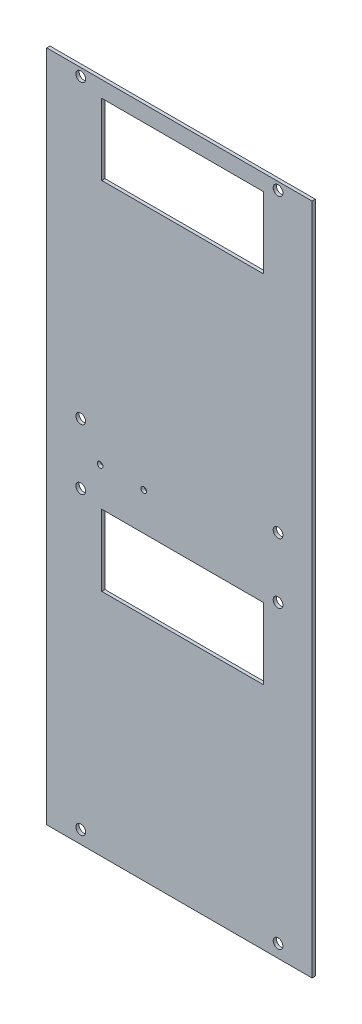
ISO-10303-21;
HEADER;
FILE_DESCRIPTION(('STEP AP214'),'2;1');
FILE_NAME('part.step','',(''),(''),'','','');
FILE_SCHEMA(('AUTOMOTIVE_DESIGN { 1 0 10303 214 1 1 1 1 }'));
ENDSEC;
DATA;
#1=APPLICATION_CONTEXT('core data for automotive mechanical design processes');
#2=APPLICATION_PROTOCOL_DEFINITION('international standard','automotive_design',2000,#1);
#3=PRODUCT_CONTEXT('',#1,'mechanical');
#4=PRODUCT('Part','Part','',(#3));
#5=PRODUCT_RELATED_PRODUCT_CATEGORY('part','',(#4));
#6=PRODUCT_DEFINITION_FORMATION('','',#4);
#7=PRODUCT_DEFINITION_CONTEXT('part definition',#1,'design');
#8=PRODUCT_DEFINITION('design','',#6,#7);
#9=PRODUCT_DEFINITION_SHAPE('','',#8);
#10=(LENGTH_UNIT() NAMED_UNIT(*) SI_UNIT(.MILLI.,.METRE.));
#11=(NAMED_UNIT(*) PLANE_ANGLE_UNIT() SI_UNIT($,.RADIAN.));
#12=(NAMED_UNIT(*) SI_UNIT($,.STERADIAN.) SOLID_ANGLE_UNIT());
#13=UNCERTAINTY_MEASURE_WITH_UNIT(LENGTH_MEASURE(1.E-05),#10,'distance_accuracy_value','');
#14=(GEOMETRIC_REPRESENTATION_CONTEXT(3) GLOBAL_UNCERTAINTY_ASSIGNED_CONTEXT((#13)) GLOBAL_UNIT_ASSIGNED_CONTEXT((#10,
#11,#12)) REPRESENTATION_CONTEXT('',''));
#15=CARTESIAN_POINT('',(0.,0.,0.));
#16=DIRECTION('',(0.,0.,1.));
#17=DIRECTION('',(1.,0.,0.));
#18=AXIS2_PLACEMENT_3D('',#15,#16,#17);
#19=CARTESIAN_POINT('',(-41.,-104.,1.));
#20=DIRECTION('',(1.,0.,0.));
#21=DIRECTION('',(0.,0.,-1.));
#22=AXIS2_PLACEMENT_3D('',#19,#20,#21);
#23=PLANE('',#22);
#24=DIRECTION('',(0.,-1.,0.));
#25=VECTOR('',#24,1.);
#26=CARTESIAN_POINT('',(-41.,-104.,0.));
#27=LINE('',#26,#25);
#28=CARTESIAN_POINT('',(-41.,104.,0.));
#29=VERTEX_POINT('',#28);
#30=CARTESIAN_POINT('',(-41.,-104.,0.));
#31=VERTEX_POINT('',#30);
#32=EDGE_CURVE('E237',#29,#31,#27,.T.);
#33=ORIENTED_EDGE('',*,*,#32,.T.);
#34=DIRECTION('',(0.,0.,-1.));
#35=VECTOR('',#34,1.);
#36=CARTESIAN_POINT('',(-41.,-104.,1.));
#37=LINE('',#36,#35);
#38=CARTESIAN_POINT('',(-41.,-104.,1.));
#39=VERTEX_POINT('',#38);
#40=EDGE_CURVE('E11',#39,#31,#37,.T.);
#41=ORIENTED_EDGE('',*,*,#40,.F.);
#42=DIRECTION('',(0.,-1.,0.));
#43=VECTOR('',#42,1.);
#44=CARTESIAN_POINT('',(-41.,-104.,1.));
#45=LINE('',#44,#43);
#46=CARTESIAN_POINT('',(-41.,104.,1.));
#47=VERTEX_POINT('',#46);
#48=EDGE_CURVE('E238',#47,#39,#45,.T.);
#49=ORIENTED_EDGE('',*,*,#48,.F.);
#50=DIRECTION('',(0.,0.,-1.));
#51=VECTOR('',#50,1.);
#52=CARTESIAN_POINT('',(-41.,104.,1.));
#53=LINE('',#52,#51);
#54=EDGE_CURVE('E248',#47,#29,#53,.T.);
#55=ORIENTED_EDGE('',*,*,#54,.T.);
#56=EDGE_LOOP('',(#33,#41,#49,#55));
#57=FACE_BOUND('',#56,.T.);
#58=ADVANCED_FACE('F37',(#57),#23,.F.);
#59=CARTESIAN_POINT('',(41.,-104.,1.));
#60=DIRECTION('',(0.,1.,0.));
#61=DIRECTION('',(-1.,0.,0.));
#62=AXIS2_PLACEMENT_3D('',#59,#60,#61);
#63=PLANE('',#62);
#64=DIRECTION('',(1.,0.,0.));
#65=VECTOR('',#64,1.);
#66=CARTESIAN_POINT('',(41.,-104.,0.));
#67=LINE('',#66,#65);
#68=CARTESIAN_POINT('',(41.,-104.,0.));
#69=VERTEX_POINT('',#68);
#70=EDGE_CURVE('E251',#31,#69,#67,.T.);
#71=ORIENTED_EDGE('',*,*,#70,.T.);
#72=DIRECTION('',(0.,0.,-1.));
#73=VECTOR('',#72,1.);
#74=CARTESIAN_POINT('',(41.,-104.,1.));
#75=LINE('',#74,#73);
#76=CARTESIAN_POINT('',(41.,-104.,1.));
#77=VERTEX_POINT('',#76);
#78=EDGE_CURVE('E44',#77,#69,#75,.T.);
#79=ORIENTED_EDGE('',*,*,#78,.F.);
#80=DIRECTION('',(1.,0.,0.));
#81=VECTOR('',#80,1.);
#82=CARTESIAN_POINT('',(41.,-104.,1.));
#83=LINE('',#82,#81);
#84=EDGE_CURVE('E241',#39,#77,#83,.T.);
#85=ORIENTED_EDGE('',*,*,#84,.F.);
#86=ORIENTED_EDGE('',*,*,#40,.T.);
#87=EDGE_LOOP('',(#71,#79,#85,#86));
#88=FACE_BOUND('',#87,.T.);
#89=ADVANCED_FACE('F280',(#88),#63,.F.);
#90=CARTESIAN_POINT('',(41.,-104.,1.));
#91=DIRECTION('',(-1.,0.,0.));
#92=DIRECTION('',(0.,0.,1.));
#93=AXIS2_PLACEMENT_3D('',#90,#91,#92);
#94=PLANE('',#93);
#95=DIRECTION('',(0.,1.,0.));
#96=VECTOR('',#95,1.);
#97=CARTESIAN_POINT('',(41.,-104.,0.));
#98=LINE('',#97,#96);
#99=CARTESIAN_POINT('',(41.,104.,0.));
#100=VERTEX_POINT('',#99);
#101=EDGE_CURVE('E253',#69,#100,#98,.T.);
#102=ORIENTED_EDGE('',*,*,#101,.T.);
#103=DIRECTION('',(0.,0.,-1.));
#104=VECTOR('',#103,1.);
#105=CARTESIAN_POINT('',(41.,104.,1.));
#106=LINE('',#105,#104);
#107=CARTESIAN_POINT('',(41.,104.,1.));
#108=VERTEX_POINT('',#107);
#109=EDGE_CURVE('E258',#108,#100,#106,.T.);
#110=ORIENTED_EDGE('',*,*,#109,.F.);
#111=DIRECTION('',(0.,1.,0.));
#112=VECTOR('',#111,1.);
#113=CARTESIAN_POINT('',(41.,-104.,1.));
#114=LINE('',#113,#112);
#115=EDGE_CURVE('E244',#77,#108,#114,.T.);
#116=ORIENTED_EDGE('',*,*,#115,.F.);
#117=ORIENTED_EDGE('',*,*,#78,.T.);
#118=EDGE_LOOP('',(#102,#110,#116,#117));
#119=FACE_BOUND('',#118,.T.);
#120=ADVANCED_FACE('F265',(#119),#94,.F.);
#121=CARTESIAN_POINT('',(41.,104.,1.));
#122=DIRECTION('',(0.,-1.,0.));
#123=DIRECTION('',(0.,0.,-1.));
#124=AXIS2_PLACEMENT_3D('',#121,#122,#123);
#125=PLANE('',#124);
#126=DIRECTION('',(-1.,0.,0.));
#127=VECTOR('',#126,1.);
#128=CARTESIAN_POINT('',(41.,104.,0.));
#129=LINE('',#128,#127);
#130=EDGE_CURVE('E242',#100,#29,#129,.T.);
#131=ORIENTED_EDGE('',*,*,#130,.T.);
#132=ORIENTED_EDGE('',*,*,#54,.F.);
#133=DIRECTION('',(-1.,0.,0.));
#134=VECTOR('',#133,1.);
#135=CARTESIAN_POINT('',(41.,104.,1.));
#136=LINE('',#135,#134);
#137=EDGE_CURVE('E246',#108,#47,#136,.T.);
#138=ORIENTED_EDGE('',*,*,#137,.F.);
#139=ORIENTED_EDGE('',*,*,#109,.T.);
#140=EDGE_LOOP('',(#131,#132,#138,#139));
#141=FACE_BOUND('',#140,.T.);
#142=ADVANCED_FACE('F273',(#141),#125,.F.);
#143=CARTESIAN_POINT('',(0.,0.,1.));
#144=DIRECTION('',(0.,0.,1.));
#145=DIRECTION('',(1.,0.,0.));
#146=AXIS2_PLACEMENT_3D('',#143,#144,#145);
#147=PLANE('',#146);
#148=CARTESIAN_POINT('',(-24.5,0.649999999999582,1.));
#149=DIRECTION('',(0.,0.,-1.));
#150=DIRECTION('',(-1.,0.,0.));
#151=AXIS2_PLACEMENT_3D('',#148,#149,#150);
#152=CIRCLE('',#151,0.874999999999997);
#153=CARTESIAN_POINT('',(-25.375,0.649999999999582,1.));
#154=VERTEX_POINT('',#153);
#155=EDGE_CURVE('E367',#154,#154,#152,.T.);
#156=ORIENTED_EDGE('',*,*,#155,.T.);
#157=EDGE_LOOP('',(#156));
#158=FACE_BOUND('',#157,.T.);
#159=CARTESIAN_POINT('',(-11.,0.649999999999583,1.));
#160=DIRECTION('',(0.,0.,-1.));
#161=DIRECTION('',(-1.,0.,0.));
#162=AXIS2_PLACEMENT_3D('',#159,#160,#161);
#163=CIRCLE('',#162,0.874999999999999);
#164=CARTESIAN_POINT('',(-11.875,0.649999999999583,1.));
#165=VERTEX_POINT('',#164);
#166=EDGE_CURVE('E377',#165,#165,#163,.T.);
#167=ORIENTED_EDGE('',*,*,#166,.T.);
#168=EDGE_LOOP('',(#167));
#169=FACE_BOUND('',#168,.T.);
#170=DIRECTION('',(0.,1.,0.));
#171=VECTOR('',#170,1.);
#172=CARTESIAN_POINT('',(26.,0.,1.));
#173=LINE('',#172,#171);
#174=CARTESIAN_POINT('',(26.,77.,0.999999999999999));
#175=VERTEX_POINT('',#174);
#176=CARTESIAN_POINT('',(26.,99.,0.999999999999999));
#177=VERTEX_POINT('',#176);
#178=EDGE_CURVE('E158',#175,#177,#173,.T.);
#179=ORIENTED_EDGE('',*,*,#178,.F.);
#180=DIRECTION('',(1.,0.,0.));
#181=VECTOR('',#180,1.);
#182=CARTESIAN_POINT('',(0.,77.,1.));
#183=LINE('',#182,#181);
#184=CARTESIAN_POINT('',(-24.,77.,1.));
#185=VERTEX_POINT('',#184);
#186=EDGE_CURVE('E151',#185,#175,#183,.T.);
#187=ORIENTED_EDGE('',*,*,#186,.F.);
#188=DIRECTION('',(0.,-1.,0.));
#189=VECTOR('',#188,1.);
#190=CARTESIAN_POINT('',(-24.,0.,1.));
#191=LINE('',#190,#189);
#192=CARTESIAN_POINT('',(-24.,99.,0.999999999999999));
#193=VERTEX_POINT('',#192);
#194=EDGE_CURVE('E131',#193,#185,#191,.T.);
#195=ORIENTED_EDGE('',*,*,#194,.F.);
#196=DIRECTION('',(-1.,0.,0.));
#197=VECTOR('',#196,1.);
#198=CARTESIAN_POINT('',(0.,99.,1.));
#199=LINE('',#198,#197);
#200=EDGE_CURVE('E156',#177,#193,#199,.T.);
#201=ORIENTED_EDGE('',*,*,#200,.F.);
#202=EDGE_LOOP('',(#179,#187,#195,#201));
#203=FACE_BOUND('',#202,.T.);
#204=DIRECTION('',(0.,1.,0.));
#205=VECTOR('',#204,1.);
#206=CARTESIAN_POINT('',(26.,0.,1.));
#207=LINE('',#206,#205);
#208=CARTESIAN_POINT('',(26.,-33.,0.999999999999999));
#209=VERTEX_POINT('',#208);
#210=CARTESIAN_POINT('',(26.,-11.,0.999999999999999));
#211=VERTEX_POINT('',#210);
#212=EDGE_CURVE('E187',#209,#211,#207,.T.);
#213=ORIENTED_EDGE('',*,*,#212,.F.);
#214=DIRECTION('',(1.,0.,0.));
#215=VECTOR('',#214,1.);
#216=CARTESIAN_POINT('',(0.,-33.,1.));
#217=LINE('',#216,#215);
#218=CARTESIAN_POINT('',(-24.,-33.,1.));
#219=VERTEX_POINT('',#218);
#220=EDGE_CURVE('E174',#219,#209,#217,.T.);
#221=ORIENTED_EDGE('',*,*,#220,.F.);
#222=DIRECTION('',(0.,-1.,0.));
#223=VECTOR('',#222,1.);
#224=CARTESIAN_POINT('',(-24.,0.,1.));
#225=LINE('',#224,#223);
#226=CARTESIAN_POINT('',(-24.,-11.,0.999999999999999));
#227=VERTEX_POINT('',#226);
#228=EDGE_CURVE('E182',#227,#219,#225,.T.);
#229=ORIENTED_EDGE('',*,*,#228,.F.);
#230=DIRECTION('',(-1.,0.,0.));
#231=VECTOR('',#230,1.);
#232=CARTESIAN_POINT('',(0.,-11.,1.));
#233=LINE('',#232,#231);
#234=EDGE_CURVE('E185',#211,#227,#233,.T.);
#235=ORIENTED_EDGE('',*,*,#234,.F.);
#236=EDGE_LOOP('',(#213,#221,#229,#235));
#237=FACE_BOUND('',#236,.T.);
#238=CARTESIAN_POINT('',(-30.5,10.0000000000003,1.));
#239=DIRECTION('',(0.,0.,1.));
#240=DIRECTION('',(1.,0.,0.));
#241=AXIS2_PLACEMENT_3D('',#238,#239,#240);
#242=CIRCLE('',#241,1.5);
#243=CARTESIAN_POINT('',(-29.,10.0000000000003,1.));
#244=VERTEX_POINT('',#243);
#245=EDGE_CURVE('E189',#244,#244,#242,.T.);
#246=ORIENTED_EDGE('',*,*,#245,.F.);
#247=EDGE_LOOP('',(#246));
#248=FACE_BOUND('',#247,.T.);
#249=CARTESIAN_POINT('',(30.5,10.,1.));
#250=DIRECTION('',(0.,0.,1.));
#251=DIRECTION('',(1.,0.,0.));
#252=AXIS2_PLACEMENT_3D('',#249,#250,#251);
#253=CIRCLE('',#252,1.5);
#254=CARTESIAN_POINT('',(32.,10.,1.));
#255=VERTEX_POINT('',#254);
#256=EDGE_CURVE('E195',#255,#255,#253,.T.);
#257=ORIENTED_EDGE('',*,*,#256,.F.);
#258=EDGE_LOOP('',(#257));
#259=FACE_BOUND('',#258,.T.);
#260=CARTESIAN_POINT('',(30.5,-100.,1.));
#261=DIRECTION('',(0.,0.,1.));
#262=DIRECTION('',(1.,0.,0.));
#263=AXIS2_PLACEMENT_3D('',#260,#261,#262);
#264=CIRCLE('',#263,1.5);
#265=CARTESIAN_POINT('',(32.,-100.,1.));
#266=VERTEX_POINT('',#265);
#267=EDGE_CURVE('E201',#266,#266,#264,.T.);
#268=ORIENTED_EDGE('',*,*,#267,.F.);
#269=EDGE_LOOP('',(#268));
#270=FACE_BOUND('',#269,.T.);
#271=CARTESIAN_POINT('',(-30.5,-100.,1.));
#272=DIRECTION('',(0.,0.,1.));
#273=DIRECTION('',(1.,0.,0.));
#274=AXIS2_PLACEMENT_3D('',#271,#272,#273);
#275=CIRCLE('',#274,1.5);
#276=CARTESIAN_POINT('',(-29.,-100.,1.));
#277=VERTEX_POINT('',#276);
#278=EDGE_CURVE('E207',#277,#277,#275,.T.);
#279=ORIENTED_EDGE('',*,*,#278,.F.);
#280=EDGE_LOOP('',(#279));
#281=FACE_BOUND('',#280,.T.);
#282=CARTESIAN_POINT('',(-30.5,101.59999968,1.));
#283=DIRECTION('',(0.,0.,1.));
#284=DIRECTION('',(1.,0.,0.));
#285=AXIS2_PLACEMENT_3D('',#282,#283,#284);
#286=CIRCLE('',#285,1.5);
#287=CARTESIAN_POINT('',(-29.,101.59999968,1.));
#288=VERTEX_POINT('',#287);
#289=EDGE_CURVE('E213',#288,#288,#286,.T.);
#290=ORIENTED_EDGE('',*,*,#289,.F.);
#291=EDGE_LOOP('',(#290));
#292=FACE_BOUND('',#291,.T.);
#293=CARTESIAN_POINT('',(30.5,101.59999968,1.));
#294=DIRECTION('',(0.,0.,1.));
#295=DIRECTION('',(1.,0.,0.));
#296=AXIS2_PLACEMENT_3D('',#293,#294,#295);
#297=CIRCLE('',#296,1.5);
#298=CARTESIAN_POINT('',(32.,101.59999968,1.));
#299=VERTEX_POINT('',#298);
#300=EDGE_CURVE('E219',#299,#299,#297,.T.);
#301=ORIENTED_EDGE('',*,*,#300,.F.);
#302=EDGE_LOOP('',(#301));
#303=FACE_BOUND('',#302,.T.);
#304=CARTESIAN_POINT('',(30.5000000000021,-8.70000000000041,1.));
#305=DIRECTION('',(0.,0.,1.));
#306=DIRECTION('',(1.,0.,0.));
#307=AXIS2_PLACEMENT_3D('',#304,#305,#306);
#308=CIRCLE('',#307,1.5);
#309=CARTESIAN_POINT('',(32.0000000000022,-8.70000000000041,1.));
#310=VERTEX_POINT('',#309);
#311=EDGE_CURVE('E225',#310,#310,#308,.T.);
#312=ORIENTED_EDGE('',*,*,#311,.F.);
#313=EDGE_LOOP('',(#312));
#314=FACE_BOUND('',#313,.T.);
#315=CARTESIAN_POINT('',(-30.4999999999979,-8.70000000000041,1.));
#316=DIRECTION('',(0.,0.,1.));
#317=DIRECTION('',(1.,0.,0.));
#318=AXIS2_PLACEMENT_3D('',#315,#316,#317);
#319=CIRCLE('',#318,1.5);
#320=CARTESIAN_POINT('',(-28.9999999999979,-8.70000000000041,1.));
#321=VERTEX_POINT('',#320);
#322=EDGE_CURVE('E231',#321,#321,#319,.T.);
#323=ORIENTED_EDGE('',*,*,#322,.F.);
#324=EDGE_LOOP('',(#323));
#325=FACE_BOUND('',#324,.T.);
#326=ORIENTED_EDGE('',*,*,#48,.T.);
#327=ORIENTED_EDGE('',*,*,#84,.T.);
#328=ORIENTED_EDGE('',*,*,#115,.T.);
#329=ORIENTED_EDGE('',*,*,#137,.T.);
#330=EDGE_LOOP('',(#326,#327,#328,#329));
#331=FACE_BOUND('',#330,.T.);
#332=ADVANCED_FACE('F279',(#158,#169,#203,#237,#248,#259,#270,#281,#292,#303,#314,#325,#331),
#147,.T.);
#333=CARTESIAN_POINT('',(0.,0.,0.));
#334=DIRECTION('',(0.,0.,1.));
#335=DIRECTION('',(1.,0.,0.));
#336=AXIS2_PLACEMENT_3D('',#333,#334,#335);
#337=PLANE('',#336);
#338=CARTESIAN_POINT('',(-24.5,0.649999999999582,0.));
#339=DIRECTION('',(0.,0.,-1.));
#340=DIRECTION('',(-1.,0.,0.));
#341=AXIS2_PLACEMENT_3D('',#338,#339,#340);
#342=CIRCLE('',#341,0.875000000000001);
#343=CARTESIAN_POINT('',(-25.375,0.649999999999582,0.));
#344=VERTEX_POINT('',#343);
#345=EDGE_CURVE('E370',#344,#344,#342,.T.);
#346=ORIENTED_EDGE('',*,*,#345,.F.);
#347=EDGE_LOOP('',(#346));
#348=FACE_BOUND('',#347,.T.);
#349=CARTESIAN_POINT('',(-11.,0.649999999999583,0.));
#350=DIRECTION('',(0.,0.,-1.));
#351=DIRECTION('',(-1.,0.,0.));
#352=AXIS2_PLACEMENT_3D('',#349,#350,#351);
#353=CIRCLE('',#352,0.874999999999999);
#354=CARTESIAN_POINT('',(-11.875,0.649999999999583,0.));
#355=VERTEX_POINT('',#354);
#356=EDGE_CURVE('E372',#355,#355,#353,.T.);
#357=ORIENTED_EDGE('',*,*,#356,.F.);
#358=EDGE_LOOP('',(#357));
#359=FACE_BOUND('',#358,.T.);
#360=DIRECTION('',(-1.,0.,0.));
#361=VECTOR('',#360,1.);
#362=CARTESIAN_POINT('',(26.,77.,0.));
#363=LINE('',#362,#361);
#364=CARTESIAN_POINT('',(26.,77.,0.));
#365=VERTEX_POINT('',#364);
#366=CARTESIAN_POINT('',(-24.,77.,0.));
#367=VERTEX_POINT('',#366);
#368=EDGE_CURVE('E137',#365,#367,#363,.T.);
#369=ORIENTED_EDGE('',*,*,#368,.F.);
#370=DIRECTION('',(0.,-1.,0.));
#371=VECTOR('',#370,1.);
#372=CARTESIAN_POINT('',(26.,77.,0.));
#373=LINE('',#372,#371);
#374=CARTESIAN_POINT('',(26.,99.,0.));
#375=VERTEX_POINT('',#374);
#376=EDGE_CURVE('E59',#375,#365,#373,.T.);
#377=ORIENTED_EDGE('',*,*,#376,.F.);
#378=DIRECTION('',(1.,0.,0.));
#379=VECTOR('',#378,1.);
#380=CARTESIAN_POINT('',(26.,99.,0.));
#381=LINE('',#380,#379);
#382=CARTESIAN_POINT('',(-24.,99.,0.));
#383=VERTEX_POINT('',#382);
#384=EDGE_CURVE('E144',#383,#375,#381,.T.);
#385=ORIENTED_EDGE('',*,*,#384,.F.);
#386=DIRECTION('',(0.,1.,0.));
#387=VECTOR('',#386,1.);
#388=CARTESIAN_POINT('',(-24.,77.,0.));
#389=LINE('',#388,#387);
#390=EDGE_CURVE('E128',#367,#383,#389,.T.);
#391=ORIENTED_EDGE('',*,*,#390,.F.);
#392=EDGE_LOOP('',(#369,#377,#385,#391));
#393=FACE_BOUND('',#392,.T.);
#394=DIRECTION('',(-1.,0.,0.));
#395=VECTOR('',#394,1.);
#396=CARTESIAN_POINT('',(26.,-33.,0.));
#397=LINE('',#396,#395);
#398=CARTESIAN_POINT('',(26.,-33.,0.));
#399=VERTEX_POINT('',#398);
#400=CARTESIAN_POINT('',(-24.,-33.,0.));
#401=VERTEX_POINT('',#400);
#402=EDGE_CURVE('E162',#399,#401,#397,.T.);
#403=ORIENTED_EDGE('',*,*,#402,.F.);
#404=DIRECTION('',(0.,-1.,0.));
#405=VECTOR('',#404,1.);
#406=CARTESIAN_POINT('',(26.,-33.,0.));
#407=LINE('',#406,#405);
#408=CARTESIAN_POINT('',(26.,-11.,0.));
#409=VERTEX_POINT('',#408);
#410=EDGE_CURVE('E160',#409,#399,#407,.T.);
#411=ORIENTED_EDGE('',*,*,#410,.F.);
#412=DIRECTION('',(1.,0.,0.));
#413=VECTOR('',#412,1.);
#414=CARTESIAN_POINT('',(26.,-11.,0.));
#415=LINE('',#414,#413);
#416=CARTESIAN_POINT('',(-24.,-11.,0.));
#417=VERTEX_POINT('',#416);
#418=EDGE_CURVE('E168',#417,#409,#415,.T.);
#419=ORIENTED_EDGE('',*,*,#418,.F.);
#420=DIRECTION('',(0.,1.,0.));
#421=VECTOR('',#420,1.);
#422=CARTESIAN_POINT('',(-24.,-33.,0.));
#423=LINE('',#422,#421);
#424=EDGE_CURVE('E165',#401,#417,#423,.T.);
#425=ORIENTED_EDGE('',*,*,#424,.F.);
#426=EDGE_LOOP('',(#403,#411,#419,#425));
#427=FACE_BOUND('',#426,.T.);
#428=CARTESIAN_POINT('',(-30.5,10.0000000000003,0.));
#429=DIRECTION('',(0.,0.,1.));
#430=DIRECTION('',(1.,0.,0.));
#431=AXIS2_PLACEMENT_3D('',#428,#429,#430);
#432=CIRCLE('',#431,1.5);
#433=CARTESIAN_POINT('',(-29.,10.0000000000003,0.));
#434=VERTEX_POINT('',#433);
#435=EDGE_CURVE('E192',#434,#434,#432,.T.);
#436=ORIENTED_EDGE('',*,*,#435,.T.);
#437=EDGE_LOOP('',(#436));
#438=FACE_BOUND('',#437,.T.);
#439=CARTESIAN_POINT('',(30.5,10.,0.));
#440=DIRECTION('',(0.,0.,1.));
#441=DIRECTION('',(1.,0.,0.));
#442=AXIS2_PLACEMENT_3D('',#439,#440,#441);
#443=CIRCLE('',#442,1.5);
#444=CARTESIAN_POINT('',(32.,10.,0.));
#445=VERTEX_POINT('',#444);
#446=EDGE_CURVE('E198',#445,#445,#443,.T.);
#447=ORIENTED_EDGE('',*,*,#446,.T.);
#448=EDGE_LOOP('',(#447));
#449=FACE_BOUND('',#448,.T.);
#450=CARTESIAN_POINT('',(30.5,-100.,0.));
#451=DIRECTION('',(0.,0.,1.));
#452=DIRECTION('',(1.,0.,0.));
#453=AXIS2_PLACEMENT_3D('',#450,#451,#452);
#454=CIRCLE('',#453,1.5);
#455=CARTESIAN_POINT('',(32.,-100.,0.));
#456=VERTEX_POINT('',#455);
#457=EDGE_CURVE('E204',#456,#456,#454,.T.);
#458=ORIENTED_EDGE('',*,*,#457,.T.);
#459=EDGE_LOOP('',(#458));
#460=FACE_BOUND('',#459,.T.);
#461=CARTESIAN_POINT('',(-30.5,-100.,0.));
#462=DIRECTION('',(0.,0.,1.));
#463=DIRECTION('',(1.,0.,0.));
#464=AXIS2_PLACEMENT_3D('',#461,#462,#463);
#465=CIRCLE('',#464,1.5);
#466=CARTESIAN_POINT('',(-29.,-100.,0.));
#467=VERTEX_POINT('',#466);
#468=EDGE_CURVE('E210',#467,#467,#465,.T.);
#469=ORIENTED_EDGE('',*,*,#468,.T.);
#470=EDGE_LOOP('',(#469));
#471=FACE_BOUND('',#470,.T.);
#472=CARTESIAN_POINT('',(-30.5,101.59999968,0.));
#473=DIRECTION('',(0.,0.,1.));
#474=DIRECTION('',(1.,0.,0.));
#475=AXIS2_PLACEMENT_3D('',#472,#473,#474);
#476=CIRCLE('',#475,1.5);
#477=CARTESIAN_POINT('',(-29.,101.59999968,0.));
#478=VERTEX_POINT('',#477);
#479=EDGE_CURVE('E216',#478,#478,#476,.T.);
#480=ORIENTED_EDGE('',*,*,#479,.T.);
#481=EDGE_LOOP('',(#480));
#482=FACE_BOUND('',#481,.T.);
#483=CARTESIAN_POINT('',(30.5,101.59999968,0.));
#484=DIRECTION('',(0.,0.,1.));
#485=DIRECTION('',(1.,0.,0.));
#486=AXIS2_PLACEMENT_3D('',#483,#484,#485);
#487=CIRCLE('',#486,1.5);
#488=CARTESIAN_POINT('',(32.,101.59999968,0.));
#489=VERTEX_POINT('',#488);
#490=EDGE_CURVE('E222',#489,#489,#487,.T.);
#491=ORIENTED_EDGE('',*,*,#490,.T.);
#492=EDGE_LOOP('',(#491));
#493=FACE_BOUND('',#492,.T.);
#494=CARTESIAN_POINT('',(30.5000000000021,-8.70000000000041,0.));
#495=DIRECTION('',(0.,0.,1.));
#496=DIRECTION('',(1.,0.,0.));
#497=AXIS2_PLACEMENT_3D('',#494,#495,#496);
#498=CIRCLE('',#497,1.5);
#499=CARTESIAN_POINT('',(32.0000000000022,-8.70000000000041,0.));
#500=VERTEX_POINT('',#499);
#501=EDGE_CURVE('E228',#500,#500,#498,.T.);
#502=ORIENTED_EDGE('',*,*,#501,.T.);
#503=EDGE_LOOP('',(#502));
#504=FACE_BOUND('',#503,.T.);
#505=CARTESIAN_POINT('',(-30.4999999999979,-8.70000000000041,0.));
#506=DIRECTION('',(0.,0.,1.));
#507=DIRECTION('',(1.,0.,0.));
#508=AXIS2_PLACEMENT_3D('',#505,#506,#507);
#509=CIRCLE('',#508,1.5);
#510=CARTESIAN_POINT('',(-28.9999999999979,-8.70000000000041,0.));
#511=VERTEX_POINT('',#510);
#512=EDGE_CURVE('E234',#511,#511,#509,.T.);
#513=ORIENTED_EDGE('',*,*,#512,.T.);
#514=EDGE_LOOP('',(#513));
#515=FACE_BOUND('',#514,.T.);
#516=ORIENTED_EDGE('',*,*,#32,.F.);
#517=ORIENTED_EDGE('',*,*,#130,.F.);
#518=ORIENTED_EDGE('',*,*,#101,.F.);
#519=ORIENTED_EDGE('',*,*,#70,.F.);
#520=EDGE_LOOP('',(#516,#517,#518,#519));
#521=FACE_BOUND('',#520,.T.);
#522=ADVANCED_FACE('F141',(#348,#359,#393,#427,#438,#449,#460,#471,#482,#493,#504,#515,#521),
#337,.F.);
#523=CARTESIAN_POINT('',(-30.4999999999979,-8.70000000000041,1.));
#524=DIRECTION('',(0.,0.,1.));
#525=DIRECTION('',(1.,0.,0.));
#526=AXIS2_PLACEMENT_3D('',#523,#524,#525);
#527=CYLINDRICAL_SURFACE('',#526,1.5);
#528=ORIENTED_EDGE('',*,*,#512,.F.);
#529=EDGE_LOOP('',(#528));
#530=FACE_BOUND('',#529,.T.);
#531=ORIENTED_EDGE('',*,*,#322,.T.);
#532=EDGE_LOOP('',(#531));
#533=FACE_BOUND('',#532,.T.);
#534=ADVANCED_FACE('F292',(#530,#533),#527,.F.);
#535=CARTESIAN_POINT('',(30.5000000000021,-8.70000000000041,1.));
#536=DIRECTION('',(0.,0.,1.));
#537=DIRECTION('',(1.,0.,0.));
#538=AXIS2_PLACEMENT_3D('',#535,#536,#537);
#539=CYLINDRICAL_SURFACE('',#538,1.5);
#540=ORIENTED_EDGE('',*,*,#501,.F.);
#541=EDGE_LOOP('',(#540));
#542=FACE_BOUND('',#541,.T.);
#543=ORIENTED_EDGE('',*,*,#311,.T.);
#544=EDGE_LOOP('',(#543));
#545=FACE_BOUND('',#544,.T.);
#546=ADVANCED_FACE('F299',(#542,#545),#539,.F.);
#547=CARTESIAN_POINT('',(30.5,101.59999968,1.));
#548=DIRECTION('',(0.,0.,1.));
#549=DIRECTION('',(1.,0.,0.));
#550=AXIS2_PLACEMENT_3D('',#547,#548,#549);
#551=CYLINDRICAL_SURFACE('',#550,1.5);
#552=ORIENTED_EDGE('',*,*,#490,.F.);
#553=EDGE_LOOP('',(#552));
#554=FACE_BOUND('',#553,.T.);
#555=ORIENTED_EDGE('',*,*,#300,.T.);
#556=EDGE_LOOP('',(#555));
#557=FACE_BOUND('',#556,.T.);
#558=ADVANCED_FACE('F303',(#554,#557),#551,.F.);
#559=CARTESIAN_POINT('',(-30.5,101.59999968,1.));
#560=DIRECTION('',(0.,0.,1.));
#561=DIRECTION('',(1.,0.,0.));
#562=AXIS2_PLACEMENT_3D('',#559,#560,#561);
#563=CYLINDRICAL_SURFACE('',#562,1.5);
#564=ORIENTED_EDGE('',*,*,#479,.F.);
#565=EDGE_LOOP('',(#564));
#566=FACE_BOUND('',#565,.T.);
#567=ORIENTED_EDGE('',*,*,#289,.T.);
#568=EDGE_LOOP('',(#567));
#569=FACE_BOUND('',#568,.T.);
#570=ADVANCED_FACE('F307',(#566,#569),#563,.F.);
#571=CARTESIAN_POINT('',(-30.5,-100.,1.));
#572=DIRECTION('',(0.,0.,1.));
#573=DIRECTION('',(1.,0.,0.));
#574=AXIS2_PLACEMENT_3D('',#571,#572,#573);
#575=CYLINDRICAL_SURFACE('',#574,1.5);
#576=ORIENTED_EDGE('',*,*,#468,.F.);
#577=EDGE_LOOP('',(#576));
#578=FACE_BOUND('',#577,.T.);
#579=ORIENTED_EDGE('',*,*,#278,.T.);
#580=EDGE_LOOP('',(#579));
#581=FACE_BOUND('',#580,.T.);
#582=ADVANCED_FACE('F311',(#578,#581),#575,.F.);
#583=CARTESIAN_POINT('',(30.5,-100.,1.));
#584=DIRECTION('',(0.,0.,1.));
#585=DIRECTION('',(1.,0.,0.));
#586=AXIS2_PLACEMENT_3D('',#583,#584,#585);
#587=CYLINDRICAL_SURFACE('',#586,1.5);
#588=ORIENTED_EDGE('',*,*,#457,.F.);
#589=EDGE_LOOP('',(#588));
#590=FACE_BOUND('',#589,.T.);
#591=ORIENTED_EDGE('',*,*,#267,.T.);
#592=EDGE_LOOP('',(#591));
#593=FACE_BOUND('',#592,.T.);
#594=ADVANCED_FACE('F315',(#590,#593),#587,.F.);
#595=CARTESIAN_POINT('',(30.5,10.,1.));
#596=DIRECTION('',(0.,0.,1.));
#597=DIRECTION('',(1.,0.,0.));
#598=AXIS2_PLACEMENT_3D('',#595,#596,#597);
#599=CYLINDRICAL_SURFACE('',#598,1.5);
#600=ORIENTED_EDGE('',*,*,#446,.F.);
#601=EDGE_LOOP('',(#600));
#602=FACE_BOUND('',#601,.T.);
#603=ORIENTED_EDGE('',*,*,#256,.T.);
#604=EDGE_LOOP('',(#603));
#605=FACE_BOUND('',#604,.T.);
#606=ADVANCED_FACE('F319',(#602,#605),#599,.F.);
#607=CARTESIAN_POINT('',(-30.5,10.0000000000003,1.));
#608=DIRECTION('',(0.,0.,1.));
#609=DIRECTION('',(1.,0.,0.));
#610=AXIS2_PLACEMENT_3D('',#607,#608,#609);
#611=CYLINDRICAL_SURFACE('',#610,1.5);
#612=ORIENTED_EDGE('',*,*,#435,.F.);
#613=EDGE_LOOP('',(#612));
#614=FACE_BOUND('',#613,.T.);
#615=ORIENTED_EDGE('',*,*,#245,.T.);
#616=EDGE_LOOP('',(#615));
#617=FACE_BOUND('',#616,.T.);
#618=ADVANCED_FACE('F323',(#614,#617),#611,.F.);
#619=CARTESIAN_POINT('',(26.,-33.,10.));
#620=DIRECTION('',(1.,0.,0.));
#621=DIRECTION('',(0.,0.,-1.));
#622=AXIS2_PLACEMENT_3D('',#619,#620,#621);
#623=PLANE('',#622);
#624=ORIENTED_EDGE('',*,*,#212,.T.);
#625=DIRECTION('',(0.,0.,-1.));
#626=VECTOR('',#625,1.);
#627=CARTESIAN_POINT('',(26.,-11.,10.));
#628=LINE('',#627,#626);
#629=EDGE_CURVE('E172',#211,#409,#628,.T.);
#630=ORIENTED_EDGE('',*,*,#629,.T.);
#631=ORIENTED_EDGE('',*,*,#410,.T.);
#632=DIRECTION('',(0.,0.,-1.));
#633=VECTOR('',#632,1.);
#634=CARTESIAN_POINT('',(26.,-33.,10.));
#635=LINE('',#634,#633);
#636=EDGE_CURVE('E171',#209,#399,#635,.T.);
#637=ORIENTED_EDGE('',*,*,#636,.F.);
#638=EDGE_LOOP('',(#624,#630,#631,#637));
#639=FACE_BOUND('',#638,.T.);
#640=ADVANCED_FACE('F327',(#639),#623,.F.);
#641=CARTESIAN_POINT('',(26.,-11.,10.));
#642=DIRECTION('',(0.,1.,0.));
#643=DIRECTION('',(0.,0.,1.));
#644=AXIS2_PLACEMENT_3D('',#641,#642,#643);
#645=PLANE('',#644);
#646=ORIENTED_EDGE('',*,*,#234,.T.);
#647=DIRECTION('',(0.,0.,-1.));
#648=VECTOR('',#647,1.);
#649=CARTESIAN_POINT('',(-24.,-11.,10.));
#650=LINE('',#649,#648);
#651=EDGE_CURVE('E175',#227,#417,#650,.T.);
#652=ORIENTED_EDGE('',*,*,#651,.T.);
#653=ORIENTED_EDGE('',*,*,#418,.T.);
#654=ORIENTED_EDGE('',*,*,#629,.F.);
#655=EDGE_LOOP('',(#646,#652,#653,#654));
#656=FACE_BOUND('',#655,.T.);
#657=ADVANCED_FACE('F331',(#656),#645,.F.);
#658=CARTESIAN_POINT('',(-24.,-33.,10.));
#659=DIRECTION('',(-1.,0.,0.));
#660=DIRECTION('',(0.,0.,1.));
#661=AXIS2_PLACEMENT_3D('',#658,#659,#660);
#662=PLANE('',#661);
#663=ORIENTED_EDGE('',*,*,#228,.T.);
#664=DIRECTION('',(0.,0.,-1.));
#665=VECTOR('',#664,1.);
#666=CARTESIAN_POINT('',(-24.,-33.,10.));
#667=LINE('',#666,#665);
#668=EDGE_CURVE('E177',#219,#401,#667,.T.);
#669=ORIENTED_EDGE('',*,*,#668,.T.);
#670=ORIENTED_EDGE('',*,*,#424,.T.);
#671=ORIENTED_EDGE('',*,*,#651,.F.);
#672=EDGE_LOOP('',(#663,#669,#670,#671));
#673=FACE_BOUND('',#672,.T.);
#674=ADVANCED_FACE('F337',(#673),#662,.F.);
#675=CARTESIAN_POINT('',(26.,-33.,10.));
#676=DIRECTION('',(0.,-1.,0.));
#677=DIRECTION('',(0.,0.,-1.));
#678=AXIS2_PLACEMENT_3D('',#675,#676,#677);
#679=PLANE('',#678);
#680=ORIENTED_EDGE('',*,*,#220,.T.);
#681=ORIENTED_EDGE('',*,*,#636,.T.);
#682=ORIENTED_EDGE('',*,*,#402,.T.);
#683=ORIENTED_EDGE('',*,*,#668,.F.);
#684=EDGE_LOOP('',(#680,#681,#682,#683));
#685=FACE_BOUND('',#684,.T.);
#686=ADVANCED_FACE('F333',(#685),#679,.F.);
#687=CARTESIAN_POINT('',(26.,77.,10.));
#688=DIRECTION('',(1.,0.,0.));
#689=DIRECTION('',(0.,1.,0.));
#690=AXIS2_PLACEMENT_3D('',#687,#688,#689);
#691=PLANE('',#690);
#692=ORIENTED_EDGE('',*,*,#178,.T.);
#693=DIRECTION('',(0.,0.,-1.));
#694=VECTOR('',#693,1.);
#695=CARTESIAN_POINT('',(26.,99.,10.));
#696=LINE('',#695,#694);
#697=EDGE_CURVE('E149',#177,#375,#696,.T.);
#698=ORIENTED_EDGE('',*,*,#697,.T.);
#699=ORIENTED_EDGE('',*,*,#376,.T.);
#700=DIRECTION('',(0.,0.,-1.));
#701=VECTOR('',#700,1.);
#702=CARTESIAN_POINT('',(26.,77.,10.));
#703=LINE('',#702,#701);
#704=EDGE_CURVE('E134',#175,#365,#703,.T.);
#705=ORIENTED_EDGE('',*,*,#704,.F.);
#706=EDGE_LOOP('',(#692,#698,#699,#705));
#707=FACE_BOUND('',#706,.T.);
#708=ADVANCED_FACE('F336',(#707),#691,.F.);
#709=CARTESIAN_POINT('',(26.,99.,10.));
#710=DIRECTION('',(0.,1.,0.));
#711=DIRECTION('',(0.,0.,1.));
#712=AXIS2_PLACEMENT_3D('',#709,#710,#711);
#713=PLANE('',#712);
#714=ORIENTED_EDGE('',*,*,#200,.T.);
#715=DIRECTION('',(0.,0.,-1.));
#716=VECTOR('',#715,1.);
#717=CARTESIAN_POINT('',(-24.,99.,10.));
#718=LINE('',#717,#716);
#719=EDGE_CURVE('E133',#193,#383,#718,.T.);
#720=ORIENTED_EDGE('',*,*,#719,.T.);
#721=ORIENTED_EDGE('',*,*,#384,.T.);
#722=ORIENTED_EDGE('',*,*,#697,.F.);
#723=EDGE_LOOP('',(#714,#720,#721,#722));
#724=FACE_BOUND('',#723,.T.);
#725=ADVANCED_FACE('F347',(#724),#713,.F.);
#726=CARTESIAN_POINT('',(-24.,77.,10.));
#727=DIRECTION('',(-1.,0.,0.));
#728=DIRECTION('',(0.,0.,1.));
#729=AXIS2_PLACEMENT_3D('',#726,#727,#728);
#730=PLANE('',#729);
#731=ORIENTED_EDGE('',*,*,#194,.T.);
#732=DIRECTION('',(0.,0.,-1.));
#733=VECTOR('',#732,1.);
#734=CARTESIAN_POINT('',(-24.,77.,10.));
#735=LINE('',#734,#733);
#736=EDGE_CURVE('E51',#185,#367,#735,.T.);
#737=ORIENTED_EDGE('',*,*,#736,.T.);
#738=ORIENTED_EDGE('',*,*,#390,.T.);
#739=ORIENTED_EDGE('',*,*,#719,.F.);
#740=EDGE_LOOP('',(#731,#737,#738,#739));
#741=FACE_BOUND('',#740,.T.);
#742=ADVANCED_FACE('F125',(#741),#730,.F.);
#743=CARTESIAN_POINT('',(26.,77.,10.));
#744=DIRECTION('',(0.,-1.,0.));
#745=DIRECTION('',(0.,0.,-1.));
#746=AXIS2_PLACEMENT_3D('',#743,#744,#745);
#747=PLANE('',#746);
#748=ORIENTED_EDGE('',*,*,#186,.T.);
#749=ORIENTED_EDGE('',*,*,#704,.T.);
#750=ORIENTED_EDGE('',*,*,#368,.T.);
#751=ORIENTED_EDGE('',*,*,#736,.F.);
#752=EDGE_LOOP('',(#748,#749,#750,#751));
#753=FACE_BOUND('',#752,.T.);
#754=ADVANCED_FACE('F138',(#753),#747,.F.);
#755=CARTESIAN_POINT('',(-11.,0.649999999999583,0.));
#756=DIRECTION('',(0.,0.,-1.));
#757=DIRECTION('',(-1.,0.,0.));
#758=AXIS2_PLACEMENT_3D('',#755,#756,#757);
#759=CYLINDRICAL_SURFACE('',#758,0.874999999999999);
#760=ORIENTED_EDGE('',*,*,#166,.F.);
#761=EDGE_LOOP('',(#760));
#762=FACE_BOUND('',#761,.T.);
#763=ORIENTED_EDGE('',*,*,#356,.T.);
#764=EDGE_LOOP('',(#763));
#765=FACE_BOUND('',#764,.T.);
#766=ADVANCED_FACE('F350',(#762,#765),#759,.F.);
#767=CARTESIAN_POINT('',(-24.5,0.649999999999582,0.));
#768=DIRECTION('',(0.,0.,-1.));
#769=DIRECTION('',(-1.,0.,0.));
#770=AXIS2_PLACEMENT_3D('',#767,#768,#769);
#771=CYLINDRICAL_SURFACE('',#770,0.874999999999999);
#772=ORIENTED_EDGE('',*,*,#155,.F.);
#773=EDGE_LOOP('',(#772));
#774=FACE_BOUND('',#773,.T.);
#775=ORIENTED_EDGE('',*,*,#345,.T.);
#776=EDGE_LOOP('',(#775));
#777=FACE_BOUND('',#776,.T.);
#778=ADVANCED_FACE('F358',(#774,#777),#771,.F.);
#779=CLOSED_SHELL('',(#58,#89,#120,#142,#332,#522,#534,#546,#558,#570,#582,#594,#606,#618,#640,
#657,#674,#686,#708,#725,#742,#754,#766,#778));
#780=MANIFOLD_SOLID_BREP('B2',#779);
#781=ADVANCED_BREP_SHAPE_REPRESENTATION('',(#18,#780),#14);
#782=SHAPE_DEFINITION_REPRESENTATION(#9,#781);
ENDSEC;
END-ISO-10303-21;
